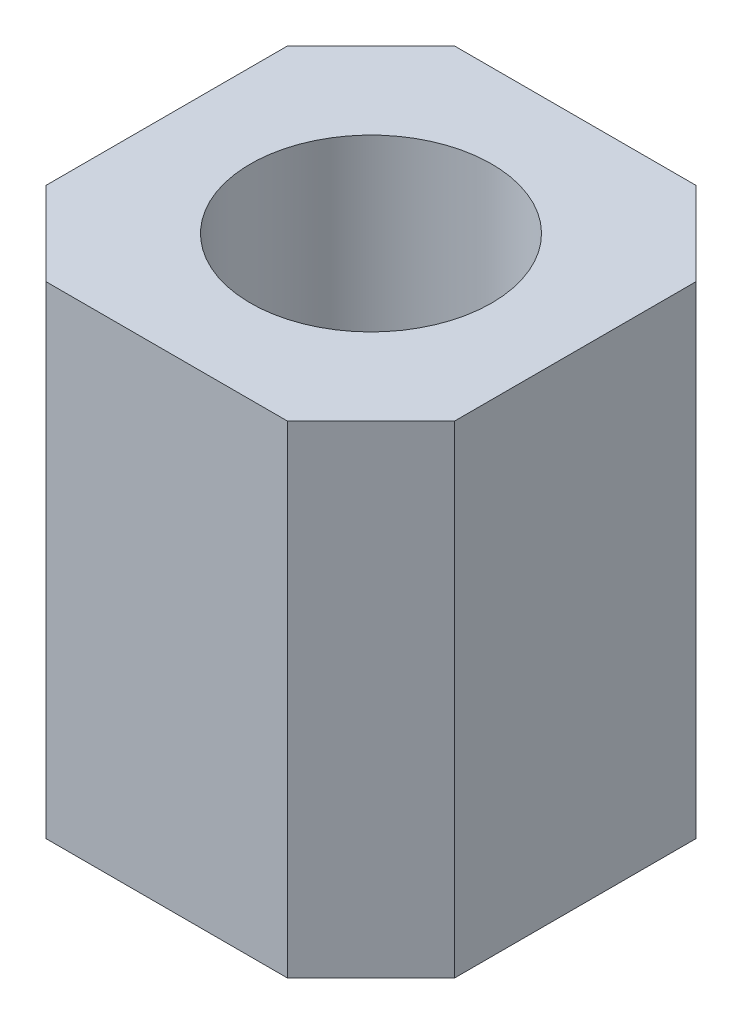
ISO-10303-21;
HEADER;
FILE_DESCRIPTION(('STEP AP214'),'2;1');
FILE_NAME('part.step','',(''),(''),'','','');
FILE_SCHEMA(('AUTOMOTIVE_DESIGN { 1 0 10303 214 1 1 1 1 }'));
ENDSEC;
DATA;
#1=APPLICATION_CONTEXT('core data for automotive mechanical design processes');
#2=APPLICATION_PROTOCOL_DEFINITION('international standard','automotive_design',2000,#1);
#3=PRODUCT_CONTEXT('',#1,'mechanical');
#4=PRODUCT('Part','Part','',(#3));
#5=PRODUCT_RELATED_PRODUCT_CATEGORY('part','',(#4));
#6=PRODUCT_DEFINITION_FORMATION('','',#4);
#7=PRODUCT_DEFINITION_CONTEXT('part definition',#1,'design');
#8=PRODUCT_DEFINITION('design','',#6,#7);
#9=PRODUCT_DEFINITION_SHAPE('','',#8);
#10=(LENGTH_UNIT() NAMED_UNIT(*) SI_UNIT(.MILLI.,.METRE.));
#11=(NAMED_UNIT(*) PLANE_ANGLE_UNIT() SI_UNIT($,.RADIAN.));
#12=(NAMED_UNIT(*) SI_UNIT($,.STERADIAN.) SOLID_ANGLE_UNIT());
#13=UNCERTAINTY_MEASURE_WITH_UNIT(LENGTH_MEASURE(1.E-05),#10,'distance_accuracy_value','');
#14=(GEOMETRIC_REPRESENTATION_CONTEXT(3) GLOBAL_UNCERTAINTY_ASSIGNED_CONTEXT((#13)) GLOBAL_UNIT_ASSIGNED_CONTEXT((#10,
#11,#12)) REPRESENTATION_CONTEXT('',''));
#15=CARTESIAN_POINT('',(0.,0.,0.));
#16=DIRECTION('',(0.,0.,1.));
#17=DIRECTION('',(1.,0.,0.));
#18=AXIS2_PLACEMENT_3D('',#15,#16,#17);
#19=CARTESIAN_POINT('',(-6.35,7.5,0.749999999999998));
#20=DIRECTION('',(1.,0.,0.));
#21=DIRECTION('',(0.,0.,-1.));
#22=AXIS2_PLACEMENT_3D('',#19,#20,#21);
#23=PLANE('',#22);
#24=DIRECTION('',(0.,0.,-1.));
#25=VECTOR('',#24,1.);
#26=CARTESIAN_POINT('',(-6.35,7.5,0.749999999999998));
#27=LINE('',#26,#25);
#28=CARTESIAN_POINT('',(-6.35,7.5,-0.750000000000003));
#29=VERTEX_POINT('',#28);
#30=CARTESIAN_POINT('',(-6.35,7.5,0.749999999999998));
#31=VERTEX_POINT('',#30);
#32=EDGE_CURVE('E78',#29,#31,#27,.F.);
#33=ORIENTED_EDGE('',*,*,#32,.T.);
#34=DIRECTION('',(0.,1.,0.));
#35=VECTOR('',#34,1.);
#36=CARTESIAN_POINT('',(-6.35,7.5,0.749999999999998));
#37=LINE('',#36,#35);
#38=CARTESIAN_POINT('',(-6.35,4.5,0.749999999999998));
#39=VERTEX_POINT('',#38);
#40=EDGE_CURVE('E87',#39,#31,#37,.T.);
#41=ORIENTED_EDGE('',*,*,#40,.F.);
#42=DIRECTION('',(0.,0.,-1.));
#43=VECTOR('',#42,1.);
#44=CARTESIAN_POINT('',(-6.35,4.5,0.749999999999998));
#45=LINE('',#44,#43);
#46=CARTESIAN_POINT('',(-6.35,4.5,-0.750000000000003));
#47=VERTEX_POINT('',#46);
#48=EDGE_CURVE('E95',#39,#47,#45,.T.);
#49=ORIENTED_EDGE('',*,*,#48,.T.);
#50=DIRECTION('',(0.,1.,0.));
#51=VECTOR('',#50,1.);
#52=CARTESIAN_POINT('',(-6.35,7.5,-0.750000000000002));
#53=LINE('',#52,#51);
#54=EDGE_CURVE('E111',#29,#47,#53,.F.);
#55=ORIENTED_EDGE('',*,*,#54,.F.);
#56=EDGE_LOOP('',(#33,#41,#49,#55));
#57=FACE_BOUND('',#56,.T.);
#58=ADVANCED_FACE('F17',(#57),#23,.T.);
#59=CARTESIAN_POINT('',(-6.87,7.5,1.27));
#60=DIRECTION('',(0.707106781186548,0.,0.707106781186547));
#61=DIRECTION('',(0.707106781186547,0.,-0.707106781186548));
#62=AXIS2_PLACEMENT_3D('',#59,#60,#61);
#63=PLANE('',#62);
#64=DIRECTION('',(0.707106781186547,0.,-0.707106781186548));
#65=VECTOR('',#64,1.);
#66=CARTESIAN_POINT('',(-6.87,7.5,1.27));
#67=LINE('',#66,#65);
#68=CARTESIAN_POINT('',(-6.87,7.5,1.27));
#69=VERTEX_POINT('',#68);
#70=EDGE_CURVE('E103',#31,#69,#67,.F.);
#71=ORIENTED_EDGE('',*,*,#70,.T.);
#72=DIRECTION('',(0.,1.,0.));
#73=VECTOR('',#72,1.);
#74=CARTESIAN_POINT('',(-6.87,7.5,1.27));
#75=LINE('',#74,#73);
#76=CARTESIAN_POINT('',(-6.87,4.5,1.27));
#77=VERTEX_POINT('',#76);
#78=EDGE_CURVE('E90',#77,#69,#75,.T.);
#79=ORIENTED_EDGE('',*,*,#78,.F.);
#80=DIRECTION('',(0.707106781186547,0.,-0.707106781186548));
#81=VECTOR('',#80,1.);
#82=CARTESIAN_POINT('',(-6.87,4.5,1.27));
#83=LINE('',#82,#81);
#84=EDGE_CURVE('E84',#77,#39,#83,.T.);
#85=ORIENTED_EDGE('',*,*,#84,.T.);
#86=ORIENTED_EDGE('',*,*,#40,.T.);
#87=EDGE_LOOP('',(#71,#79,#85,#86));
#88=FACE_BOUND('',#87,.T.);
#89=ADVANCED_FACE('F86',(#88),#63,.T.);
#90=CARTESIAN_POINT('',(-6.87,7.5,-1.27));
#91=DIRECTION('',(0.707106781186548,0.,-0.707106781186547));
#92=DIRECTION('',(-0.707106781186547,0.,-0.707106781186548));
#93=AXIS2_PLACEMENT_3D('',#90,#91,#92);
#94=PLANE('',#93);
#95=DIRECTION('',(-0.707106781186547,0.,-0.707106781186548));
#96=VECTOR('',#95,1.);
#97=CARTESIAN_POINT('',(-6.87,7.5,-1.27));
#98=LINE('',#97,#96);
#99=CARTESIAN_POINT('',(-6.87,7.5,-1.27));
#100=VERTEX_POINT('',#99);
#101=EDGE_CURVE('E109',#100,#29,#98,.F.);
#102=ORIENTED_EDGE('',*,*,#101,.T.);
#103=ORIENTED_EDGE('',*,*,#54,.T.);
#104=DIRECTION('',(-0.707106781186547,0.,-0.707106781186548));
#105=VECTOR('',#104,1.);
#106=CARTESIAN_POINT('',(-6.87,4.5,-1.27));
#107=LINE('',#106,#105);
#108=CARTESIAN_POINT('',(-6.87,4.5,-1.27));
#109=VERTEX_POINT('',#108);
#110=EDGE_CURVE('E100',#47,#109,#107,.T.);
#111=ORIENTED_EDGE('',*,*,#110,.T.);
#112=DIRECTION('',(0.,1.,0.));
#113=VECTOR('',#112,1.);
#114=CARTESIAN_POINT('',(-6.87,7.5,-1.27));
#115=LINE('',#114,#113);
#116=EDGE_CURVE('E122',#100,#109,#115,.F.);
#117=ORIENTED_EDGE('',*,*,#116,.F.);
#118=EDGE_LOOP('',(#102,#103,#111,#117));
#119=FACE_BOUND('',#118,.T.);
#120=ADVANCED_FACE('F187',(#119),#94,.T.);
#121=CARTESIAN_POINT('',(-8.37,7.5,1.27));
#122=DIRECTION('',(0.,0.,1.));
#123=DIRECTION('',(1.,0.,0.));
#124=AXIS2_PLACEMENT_3D('',#121,#122,#123);
#125=PLANE('',#124);
#126=DIRECTION('',(1.,0.,0.));
#127=VECTOR('',#126,1.);
#128=CARTESIAN_POINT('',(-8.37,7.5,1.27));
#129=LINE('',#128,#127);
#130=CARTESIAN_POINT('',(-8.37,7.5,1.27));
#131=VERTEX_POINT('',#130);
#132=EDGE_CURVE('E116',#69,#131,#129,.F.);
#133=ORIENTED_EDGE('',*,*,#132,.T.);
#134=DIRECTION('',(0.,1.,0.));
#135=VECTOR('',#134,1.);
#136=CARTESIAN_POINT('',(-8.37,7.5,1.27));
#137=LINE('',#136,#135);
#138=CARTESIAN_POINT('',(-8.37,4.5,1.27));
#139=VERTEX_POINT('',#138);
#140=EDGE_CURVE('E127',#139,#131,#137,.T.);
#141=ORIENTED_EDGE('',*,*,#140,.F.);
#142=DIRECTION('',(1.,0.,0.));
#143=VECTOR('',#142,1.);
#144=CARTESIAN_POINT('',(-8.37,4.5,1.27));
#145=LINE('',#144,#143);
#146=EDGE_CURVE('E113',#139,#77,#145,.T.);
#147=ORIENTED_EDGE('',*,*,#146,.T.);
#148=ORIENTED_EDGE('',*,*,#78,.T.);
#149=EDGE_LOOP('',(#133,#141,#147,#148));
#150=FACE_BOUND('',#149,.T.);
#151=ADVANCED_FACE('F183',(#150),#125,.T.);
#152=CARTESIAN_POINT('',(-8.37,7.5,-1.27));
#153=DIRECTION('',(0.,0.,-1.));
#154=DIRECTION('',(-1.,0.,0.));
#155=AXIS2_PLACEMENT_3D('',#152,#153,#154);
#156=PLANE('',#155);
#157=DIRECTION('',(-1.,0.,0.));
#158=VECTOR('',#157,1.);
#159=CARTESIAN_POINT('',(-8.37,7.5,-1.27));
#160=LINE('',#159,#158);
#161=CARTESIAN_POINT('',(-8.37,7.5,-1.27));
#162=VERTEX_POINT('',#161);
#163=EDGE_CURVE('E120',#162,#100,#160,.F.);
#164=ORIENTED_EDGE('',*,*,#163,.T.);
#165=ORIENTED_EDGE('',*,*,#116,.T.);
#166=DIRECTION('',(-1.,0.,0.));
#167=VECTOR('',#166,1.);
#168=CARTESIAN_POINT('',(-8.37,4.5,-1.27));
#169=LINE('',#168,#167);
#170=CARTESIAN_POINT('',(-8.37,4.5,-1.27));
#171=VERTEX_POINT('',#170);
#172=EDGE_CURVE('E118',#109,#171,#169,.T.);
#173=ORIENTED_EDGE('',*,*,#172,.T.);
#174=DIRECTION('',(0.,1.,0.));
#175=VECTOR('',#174,1.);
#176=CARTESIAN_POINT('',(-8.37,7.5,-1.27));
#177=LINE('',#176,#175);
#178=EDGE_CURVE('E135',#162,#171,#177,.F.);
#179=ORIENTED_EDGE('',*,*,#178,.F.);
#180=EDGE_LOOP('',(#164,#165,#173,#179));
#181=FACE_BOUND('',#180,.T.);
#182=ADVANCED_FACE('F179',(#181),#156,.T.);
#183=CARTESIAN_POINT('',(-8.89,7.5,0.749999999999998));
#184=DIRECTION('',(-0.707106781186547,0.,0.707106781186548));
#185=DIRECTION('',(0.707106781186548,0.,0.707106781186547));
#186=AXIS2_PLACEMENT_3D('',#183,#184,#185);
#187=PLANE('',#186);
#188=DIRECTION('',(0.707106781186548,0.,0.707106781186547));
#189=VECTOR('',#188,1.);
#190=CARTESIAN_POINT('',(-8.89,7.5,0.749999999999998));
#191=LINE('',#190,#189);
#192=CARTESIAN_POINT('',(-8.89,7.5,0.749999999999998));
#193=VERTEX_POINT('',#192);
#194=EDGE_CURVE('E130',#131,#193,#191,.F.);
#195=ORIENTED_EDGE('',*,*,#194,.T.);
#196=DIRECTION('',(0.,1.,0.));
#197=VECTOR('',#196,1.);
#198=CARTESIAN_POINT('',(-8.89,7.5,0.749999999999998));
#199=LINE('',#198,#197);
#200=CARTESIAN_POINT('',(-8.89,4.5,0.749999999999998));
#201=VERTEX_POINT('',#200);
#202=EDGE_CURVE('E138',#201,#193,#199,.T.);
#203=ORIENTED_EDGE('',*,*,#202,.F.);
#204=DIRECTION('',(0.707106781186548,0.,0.707106781186547));
#205=VECTOR('',#204,1.);
#206=CARTESIAN_POINT('',(-8.89,4.5,0.749999999999998));
#207=LINE('',#206,#205);
#208=EDGE_CURVE('E125',#201,#139,#207,.T.);
#209=ORIENTED_EDGE('',*,*,#208,.T.);
#210=ORIENTED_EDGE('',*,*,#140,.T.);
#211=EDGE_LOOP('',(#195,#203,#209,#210));
#212=FACE_BOUND('',#211,.T.);
#213=ADVANCED_FACE('F175',(#212),#187,.T.);
#214=CARTESIAN_POINT('',(-8.89,7.5,-0.750000000000002));
#215=DIRECTION('',(-0.707106781186547,0.,-0.707106781186548));
#216=DIRECTION('',(-0.707106781186548,0.,0.707106781186547));
#217=AXIS2_PLACEMENT_3D('',#214,#215,#216);
#218=PLANE('',#217);
#219=DIRECTION('',(-0.707106781186548,0.,0.707106781186547));
#220=VECTOR('',#219,1.);
#221=CARTESIAN_POINT('',(-8.89,7.5,-0.750000000000002));
#222=LINE('',#221,#220);
#223=CARTESIAN_POINT('',(-8.89,7.5,-0.750000000000002));
#224=VERTEX_POINT('',#223);
#225=EDGE_CURVE('E33',#224,#162,#222,.F.);
#226=ORIENTED_EDGE('',*,*,#225,.T.);
#227=ORIENTED_EDGE('',*,*,#178,.T.);
#228=DIRECTION('',(-0.707106781186548,0.,0.707106781186547));
#229=VECTOR('',#228,1.);
#230=CARTESIAN_POINT('',(-8.89,4.5,-0.750000000000002));
#231=LINE('',#230,#229);
#232=CARTESIAN_POINT('',(-8.89,4.5,-0.750000000000002));
#233=VERTEX_POINT('',#232);
#234=EDGE_CURVE('E132',#171,#233,#231,.T.);
#235=ORIENTED_EDGE('',*,*,#234,.T.);
#236=DIRECTION('',(0.,1.,0.));
#237=VECTOR('',#236,1.);
#238=CARTESIAN_POINT('',(-8.89,7.5,-0.750000000000002));
#239=LINE('',#238,#237);
#240=EDGE_CURVE('E141',#224,#233,#239,.F.);
#241=ORIENTED_EDGE('',*,*,#240,.F.);
#242=EDGE_LOOP('',(#226,#227,#235,#241));
#243=FACE_BOUND('',#242,.T.);
#244=ADVANCED_FACE('F171',(#243),#218,.T.);
#245=CARTESIAN_POINT('',(-8.89,7.5,0.749999999999998));
#246=DIRECTION('',(-1.,0.,0.));
#247=DIRECTION('',(0.,0.,1.));
#248=AXIS2_PLACEMENT_3D('',#245,#246,#247);
#249=PLANE('',#248);
#250=DIRECTION('',(0.,0.,1.));
#251=VECTOR('',#250,1.);
#252=CARTESIAN_POINT('',(-8.89,7.5,0.));
#253=LINE('',#252,#251);
#254=EDGE_CURVE('E147',#224,#193,#253,.T.);
#255=ORIENTED_EDGE('',*,*,#254,.F.);
#256=ORIENTED_EDGE('',*,*,#240,.T.);
#257=DIRECTION('',(0.,0.,1.));
#258=VECTOR('',#257,1.);
#259=CARTESIAN_POINT('',(-8.89,4.5,0.));
#260=LINE('',#259,#258);
#261=EDGE_CURVE('E144',#233,#201,#260,.T.);
#262=ORIENTED_EDGE('',*,*,#261,.T.);
#263=ORIENTED_EDGE('',*,*,#202,.T.);
#264=EDGE_LOOP('',(#255,#256,#262,#263));
#265=FACE_BOUND('',#264,.T.);
#266=ADVANCED_FACE('F166',(#265),#249,.T.);
#267=CARTESIAN_POINT('',(-7.62,4.5,0.));
#268=DIRECTION('',(0.,1.,0.));
#269=DIRECTION('',(0.,0.,1.));
#270=AXIS2_PLACEMENT_3D('',#267,#268,#269);
#271=PLANE('',#270);
#272=ORIENTED_EDGE('',*,*,#261,.F.);
#273=ORIENTED_EDGE('',*,*,#234,.F.);
#274=ORIENTED_EDGE('',*,*,#172,.F.);
#275=ORIENTED_EDGE('',*,*,#110,.F.);
#276=ORIENTED_EDGE('',*,*,#48,.F.);
#277=ORIENTED_EDGE('',*,*,#84,.F.);
#278=ORIENTED_EDGE('',*,*,#146,.F.);
#279=ORIENTED_EDGE('',*,*,#208,.F.);
#280=EDGE_LOOP('',(#272,#273,#274,#275,#276,#277,#278,#279));
#281=FACE_BOUND('',#280,.T.);
#282=CARTESIAN_POINT('',(-7.62,4.5,0.));
#283=DIRECTION('',(0.,-1.,0.));
#284=DIRECTION('',(1.,0.,0.));
#285=AXIS2_PLACEMENT_3D('',#282,#283,#284);
#286=CIRCLE('',#285,0.75);
#287=CARTESIAN_POINT('',(-6.87,4.5,0.));
#288=VERTEX_POINT('',#287);
#289=EDGE_CURVE('E20',#288,#288,#286,.F.);
#290=ORIENTED_EDGE('',*,*,#289,.T.);
#291=EDGE_LOOP('',(#290));
#292=FACE_BOUND('',#291,.T.);
#293=ADVANCED_FACE('F97',(#281,#292),#271,.F.);
#294=CARTESIAN_POINT('',(-7.62,7.5,0.));
#295=DIRECTION('',(0.,1.,0.));
#296=DIRECTION('',(0.,0.,1.));
#297=AXIS2_PLACEMENT_3D('',#294,#295,#296);
#298=PLANE('',#297);
#299=ORIENTED_EDGE('',*,*,#225,.F.);
#300=ORIENTED_EDGE('',*,*,#254,.T.);
#301=ORIENTED_EDGE('',*,*,#194,.F.);
#302=ORIENTED_EDGE('',*,*,#132,.F.);
#303=ORIENTED_EDGE('',*,*,#70,.F.);
#304=ORIENTED_EDGE('',*,*,#32,.F.);
#305=ORIENTED_EDGE('',*,*,#101,.F.);
#306=ORIENTED_EDGE('',*,*,#163,.F.);
#307=EDGE_LOOP('',(#299,#300,#301,#302,#303,#304,#305,#306));
#308=FACE_BOUND('',#307,.T.);
#309=CARTESIAN_POINT('',(-7.62,7.5,0.));
#310=DIRECTION('',(0.,-1.,0.));
#311=DIRECTION('',(1.,0.,0.));
#312=AXIS2_PLACEMENT_3D('',#309,#310,#311);
#313=CIRCLE('',#312,0.75);
#314=CARTESIAN_POINT('',(-6.87,7.5,0.));
#315=VERTEX_POINT('',#314);
#316=EDGE_CURVE('E11',#315,#315,#313,.T.);
#317=ORIENTED_EDGE('',*,*,#316,.T.);
#318=EDGE_LOOP('',(#317));
#319=FACE_BOUND('',#318,.T.);
#320=ADVANCED_FACE('F156',(#308,#319),#298,.T.);
#321=CARTESIAN_POINT('',(-7.62,7.5,0.));
#322=DIRECTION('',(0.,-1.,0.));
#323=DIRECTION('',(1.,0.,0.));
#324=AXIS2_PLACEMENT_3D('',#321,#322,#323);
#325=CYLINDRICAL_SURFACE('',#324,0.75);
#326=ORIENTED_EDGE('',*,*,#289,.F.);
#327=EDGE_LOOP('',(#326));
#328=FACE_BOUND('',#327,.T.);
#329=ORIENTED_EDGE('',*,*,#316,.F.);
#330=EDGE_LOOP('',(#329));
#331=FACE_BOUND('',#330,.T.);
#332=ADVANCED_FACE('F153',(#328,#331),#325,.F.);
#333=CLOSED_SHELL('',(#58,#89,#120,#151,#182,#213,#244,#266,#293,#320,#332));
#334=MANIFOLD_SOLID_BREP('B1',#333);
#335=ADVANCED_BREP_SHAPE_REPRESENTATION('',(#18,#334),#14);
#336=SHAPE_DEFINITION_REPRESENTATION(#9,#335);
ENDSEC;
END-ISO-10303-21;
